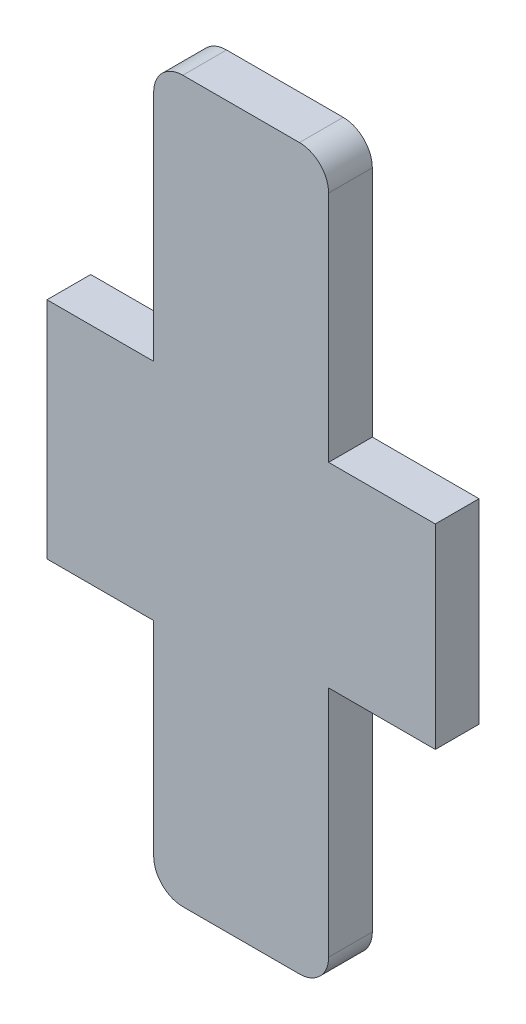
ISO-10303-21;
HEADER;
FILE_DESCRIPTION(('STEP AP214'),'2;1');
FILE_NAME('part.step','',(''),(''),'','','');
FILE_SCHEMA(('AUTOMOTIVE_DESIGN { 1 0 10303 214 1 1 1 1 }'));
ENDSEC;
DATA;
#1=APPLICATION_CONTEXT('core data for automotive mechanical design processes');
#2=APPLICATION_PROTOCOL_DEFINITION('international standard','automotive_design',2000,#1);
#3=PRODUCT_CONTEXT('',#1,'mechanical');
#4=PRODUCT('Part','Part','',(#3));
#5=PRODUCT_RELATED_PRODUCT_CATEGORY('part','',(#4));
#6=PRODUCT_DEFINITION_FORMATION('','',#4);
#7=PRODUCT_DEFINITION_CONTEXT('part definition',#1,'design');
#8=PRODUCT_DEFINITION('design','',#6,#7);
#9=PRODUCT_DEFINITION_SHAPE('','',#8);
#10=(LENGTH_UNIT() NAMED_UNIT(*) SI_UNIT(.MILLI.,.METRE.));
#11=(NAMED_UNIT(*) PLANE_ANGLE_UNIT() SI_UNIT($,.RADIAN.));
#12=(NAMED_UNIT(*) SI_UNIT($,.STERADIAN.) SOLID_ANGLE_UNIT());
#13=UNCERTAINTY_MEASURE_WITH_UNIT(LENGTH_MEASURE(1.E-05),#10,'distance_accuracy_value','');
#14=(GEOMETRIC_REPRESENTATION_CONTEXT(3) GLOBAL_UNCERTAINTY_ASSIGNED_CONTEXT((#13)) GLOBAL_UNIT_ASSIGNED_CONTEXT((#10,
#11,#12)) REPRESENTATION_CONTEXT('',''));
#15=CARTESIAN_POINT('',(0.,0.,0.));
#16=DIRECTION('',(0.,0.,1.));
#17=DIRECTION('',(1.,0.,0.));
#18=AXIS2_PLACEMENT_3D('',#15,#16,#17);
#19=CARTESIAN_POINT('',(-1595.6489981434,-37.3659039223449,3.0000000000004));
#20=DIRECTION('',(0.,1.,0.));
#21=DIRECTION('',(-1.,0.,0.));
#22=AXIS2_PLACEMENT_3D('',#19,#20,#21);
#23=PLANE('',#22);
#24=DIRECTION('',(1.,0.,0.));
#25=VECTOR('',#24,1.);
#26=CARTESIAN_POINT('',(-1595.6489981434,-37.3659039223449,3.67761376907083E-13));
#27=LINE('',#26,#25);
#28=CARTESIAN_POINT('',(-1595.6489981434,-37.3659039223449,3.67761376907083E-13));
#29=VERTEX_POINT('',#28);
#30=CARTESIAN_POINT('',(-1588.32933214503,-37.3659039223449,4.78783679369599E-13));
#31=VERTEX_POINT('',#30);
#32=EDGE_CURVE('E148',#29,#31,#27,.T.);
#33=ORIENTED_EDGE('',*,*,#32,.T.);
#34=DIRECTION('',(0.,0.,-1.));
#35=VECTOR('',#34,1.);
#36=CARTESIAN_POINT('',(-1588.32933214503,-37.3659039223449,3.0000000000005));
#37=LINE('',#36,#35);
#38=CARTESIAN_POINT('',(-1588.32933214503,-37.3659039223449,3.0000000000005));
#39=VERTEX_POINT('',#38);
#40=EDGE_CURVE('E11',#39,#31,#37,.T.);
#41=ORIENTED_EDGE('',*,*,#40,.F.);
#42=DIRECTION('',(1.,0.,0.));
#43=VECTOR('',#42,1.);
#44=CARTESIAN_POINT('',(-1595.6489981434,-37.3659039223449,3.0000000000004));
#45=LINE('',#44,#43);
#46=CARTESIAN_POINT('',(-1595.6489981434,-37.3659039223449,3.0000000000004));
#47=VERTEX_POINT('',#46);
#48=EDGE_CURVE('E191',#47,#39,#45,.T.);
#49=ORIENTED_EDGE('',*,*,#48,.F.);
#50=DIRECTION('',(0.,0.,-1.));
#51=VECTOR('',#50,1.);
#52=CARTESIAN_POINT('',(-1595.6489981434,-37.3659039223449,3.0000000000004));
#53=LINE('',#52,#51);
#54=EDGE_CURVE('E161',#47,#29,#53,.T.);
#55=ORIENTED_EDGE('',*,*,#54,.T.);
#56=EDGE_LOOP('',(#33,#41,#49,#55));
#57=FACE_BOUND('',#56,.T.);
#58=ADVANCED_FACE('F32',(#57),#23,.F.);
#59=CARTESIAN_POINT('',(-1588.32933214503,-37.3659039223449,3.0000000000005));
#60=DIRECTION('',(1.,0.,0.));
#61=DIRECTION('',(0.,1.,0.));
#62=AXIS2_PLACEMENT_3D('',#59,#60,#61);
#63=PLANE('',#62);
#64=DIRECTION('',(0.,-1.,0.));
#65=VECTOR('',#64,1.);
#66=CARTESIAN_POINT('',(-1588.32933214503,-37.3659039223449,4.78783679369599E-13));
#67=LINE('',#66,#65);
#68=CARTESIAN_POINT('',(-1588.32933214503,-51.3659039223446,7.63278329429795E-13));
#69=VERTEX_POINT('',#68);
#70=EDGE_CURVE('E144',#31,#69,#67,.T.);
#71=ORIENTED_EDGE('',*,*,#70,.T.);
#72=DIRECTION('',(0.,0.,-1.));
#73=VECTOR('',#72,1.);
#74=CARTESIAN_POINT('',(-1588.32933214503,-51.3659039223447,3.0000000000005));
#75=LINE('',#74,#73);
#76=CARTESIAN_POINT('',(-1588.32933214503,-51.3659039223447,3.0000000000005));
#77=VERTEX_POINT('',#76);
#78=EDGE_CURVE('E39',#77,#69,#75,.T.);
#79=ORIENTED_EDGE('',*,*,#78,.F.);
#80=DIRECTION('',(0.,-1.,0.));
#81=VECTOR('',#80,1.);
#82=CARTESIAN_POINT('',(-1588.32933214503,-37.3659039223449,3.0000000000005));
#83=LINE('',#82,#81);
#84=EDGE_CURVE('E157',#39,#77,#83,.T.);
#85=ORIENTED_EDGE('',*,*,#84,.F.);
#86=ORIENTED_EDGE('',*,*,#40,.T.);
#87=EDGE_LOOP('',(#71,#79,#85,#86));
#88=FACE_BOUND('',#87,.T.);
#89=ADVANCED_FACE('F156',(#88),#63,.F.);
#90=CARTESIAN_POINT('',(-1586.32933214503,-51.3659039223448,3.0000000000004));
#91=DIRECTION('',(0.,0.,-1.));
#92=DIRECTION('',(-1.,0.,0.));
#93=AXIS2_PLACEMENT_3D('',#90,#91,#92);
#94=CYLINDRICAL_SURFACE('',#93,1.99999999999978);
#95=CARTESIAN_POINT('',(-1586.32933214503,-51.3659039223447,4.85722573273506E-13));
#96=DIRECTION('',(0.,0.,1.));
#97=DIRECTION('',(-1.,0.,0.));
#98=AXIS2_PLACEMENT_3D('',#95,#96,#97);
#99=CIRCLE('',#98,1.99999999999978);
#100=CARTESIAN_POINT('',(-1586.32933214503,-53.3659039223446,2.42861286636753E-13));
#101=VERTEX_POINT('',#100);
#102=EDGE_CURVE('E150',#69,#101,#99,.T.);
#103=ORIENTED_EDGE('',*,*,#102,.T.);
#104=DIRECTION('',(0.,0.,-1.));
#105=VECTOR('',#104,1.);
#106=CARTESIAN_POINT('',(-1586.32933214503,-53.3659039223447,3.00000000000015));
#107=LINE('',#106,#105);
#108=CARTESIAN_POINT('',(-1586.32933214503,-53.3659039223447,3.00000000000015));
#109=VERTEX_POINT('',#108);
#110=EDGE_CURVE('E257',#109,#101,#107,.T.);
#111=ORIENTED_EDGE('',*,*,#110,.F.);
#112=CARTESIAN_POINT('',(-1586.32933214503,-51.3659039223448,3.0000000000004));
#113=DIRECTION('',(0.,0.,1.));
#114=DIRECTION('',(-1.,0.,0.));
#115=AXIS2_PLACEMENT_3D('',#112,#113,#114);
#116=CIRCLE('',#115,1.99999999999978);
#117=EDGE_CURVE('E194',#77,#109,#116,.T.);
#118=ORIENTED_EDGE('',*,*,#117,.F.);
#119=ORIENTED_EDGE('',*,*,#78,.T.);
#120=EDGE_LOOP('',(#103,#111,#118,#119));
#121=FACE_BOUND('',#120,.T.);
#122=ADVANCED_FACE('F261',(#121),#94,.T.);
#123=CARTESIAN_POINT('',(-1586.32933214503,-53.3659039223449,3.00000000000025));
#124=DIRECTION('',(0.,1.,0.));
#125=DIRECTION('',(-1.,0.,0.));
#126=AXIS2_PLACEMENT_3D('',#123,#124,#125);
#127=PLANE('',#126);
#128=DIRECTION('',(1.,0.,0.));
#129=VECTOR('',#128,1.);
#130=CARTESIAN_POINT('',(-1586.32933214503,-53.3659039223448,3.40005801291454E-13));
#131=LINE('',#130,#129);
#132=CARTESIAN_POINT('',(-1578.32933214503,-53.3659039223447,5.82867087928207E-13));
#133=VERTEX_POINT('',#132);
#134=EDGE_CURVE('E165',#101,#133,#131,.T.);
#135=ORIENTED_EDGE('',*,*,#134,.T.);
#136=DIRECTION('',(0.,0.,-1.));
#137=VECTOR('',#136,1.);
#138=CARTESIAN_POINT('',(-1578.32933214503,-53.3659039223447,3.00000000000058));
#139=LINE('',#138,#137);
#140=CARTESIAN_POINT('',(-1578.32933214503,-53.3659039223447,3.00000000000058));
#141=VERTEX_POINT('',#140);
#142=EDGE_CURVE('E254',#141,#133,#139,.T.);
#143=ORIENTED_EDGE('',*,*,#142,.F.);
#144=DIRECTION('',(1.,0.,0.));
#145=VECTOR('',#144,1.);
#146=CARTESIAN_POINT('',(-1586.32933214503,-53.3659039223449,3.00000000000025));
#147=LINE('',#146,#145);
#148=EDGE_CURVE('E196',#109,#141,#147,.T.);
#149=ORIENTED_EDGE('',*,*,#148,.F.);
#150=ORIENTED_EDGE('',*,*,#110,.T.);
#151=EDGE_LOOP('',(#135,#143,#149,#150));
#152=FACE_BOUND('',#151,.T.);
#153=ADVANCED_FACE('F269',(#152),#127,.F.);
#154=CARTESIAN_POINT('',(-1578.32933214503,-51.3659039223447,3.00000000000034));
#155=DIRECTION('',(0.,0.,-1.));
#156=DIRECTION('',(-1.,0.,0.));
#157=AXIS2_PLACEMENT_3D('',#154,#155,#156);
#158=CYLINDRICAL_SURFACE('',#157,1.99999999999969);
#159=CARTESIAN_POINT('',(-1578.32933214503,-51.3659039223447,4.64905891561784E-13));
#160=DIRECTION('',(0.,0.,1.));
#161=DIRECTION('',(1.,0.,0.));
#162=AXIS2_PLACEMENT_3D('',#159,#160,#161);
#163=CIRCLE('',#162,1.99999999999969);
#164=CARTESIAN_POINT('',(-1576.32933214503,-51.3659039223447,5.06539254985228E-13));
#165=VERTEX_POINT('',#164);
#166=EDGE_CURVE('E167',#133,#165,#163,.T.);
#167=ORIENTED_EDGE('',*,*,#166,.T.);
#168=DIRECTION('',(0.,0.,-1.));
#169=VECTOR('',#168,1.);
#170=CARTESIAN_POINT('',(-1576.32933214503,-51.3659039223448,3.00000000000038));
#171=LINE('',#170,#169);
#172=CARTESIAN_POINT('',(-1576.32933214503,-51.3659039223448,3.00000000000038));
#173=VERTEX_POINT('',#172);
#174=EDGE_CURVE('E251',#173,#165,#171,.T.);
#175=ORIENTED_EDGE('',*,*,#174,.F.);
#176=CARTESIAN_POINT('',(-1578.32933214503,-51.3659039223447,3.00000000000034));
#177=DIRECTION('',(0.,0.,1.));
#178=DIRECTION('',(1.,0.,0.));
#179=AXIS2_PLACEMENT_3D('',#176,#177,#178);
#180=CIRCLE('',#179,1.99999999999969);
#181=EDGE_CURVE('E198',#141,#173,#180,.T.);
#182=ORIENTED_EDGE('',*,*,#181,.F.);
#183=ORIENTED_EDGE('',*,*,#142,.T.);
#184=EDGE_LOOP('',(#167,#175,#182,#183));
#185=FACE_BOUND('',#184,.T.);
#186=ADVANCED_FACE('F272',(#185),#158,.T.);
#187=CARTESIAN_POINT('',(-1576.32933214503,-51.3659039223448,3.00000000000036));
#188=DIRECTION('',(-1.,0.,0.));
#189=DIRECTION('',(0.,0.,1.));
#190=AXIS2_PLACEMENT_3D('',#187,#188,#189);
#191=PLANE('',#190);
#192=DIRECTION('',(0.,1.,0.));
#193=VECTOR('',#192,1.);
#194=CARTESIAN_POINT('',(-1576.32933214503,-51.3659039223449,2.28983498828939E-13));
#195=LINE('',#194,#193);
#196=CARTESIAN_POINT('',(-1576.32933214503,-35.3659039223449,1.80411241501588E-13));
#197=VERTEX_POINT('',#196);
#198=EDGE_CURVE('E169',#165,#197,#195,.T.);
#199=ORIENTED_EDGE('',*,*,#198,.T.);
#200=DIRECTION('',(0.,0.,-1.));
#201=VECTOR('',#200,1.);
#202=CARTESIAN_POINT('',(-1576.32933214503,-35.3659039223448,3.00000000000031));
#203=LINE('',#202,#201);
#204=CARTESIAN_POINT('',(-1576.32933214503,-35.3659039223448,3.00000000000031));
#205=VERTEX_POINT('',#204);
#206=EDGE_CURVE('E248',#205,#197,#203,.T.);
#207=ORIENTED_EDGE('',*,*,#206,.F.);
#208=DIRECTION('',(0.,1.,0.));
#209=VECTOR('',#208,1.);
#210=CARTESIAN_POINT('',(-1576.32933214503,-51.3659039223448,3.00000000000036));
#211=LINE('',#210,#209);
#212=EDGE_CURVE('E200',#173,#205,#211,.T.);
#213=ORIENTED_EDGE('',*,*,#212,.F.);
#214=ORIENTED_EDGE('',*,*,#174,.T.);
#215=EDGE_LOOP('',(#199,#207,#213,#214));
#216=FACE_BOUND('',#215,.T.);
#217=ADVANCED_FACE('F277',(#216),#191,.F.);
#218=CARTESIAN_POINT('',(-1576.32933214503,-35.3659039223448,3.00000000000031));
#219=DIRECTION('',(0.,1.,0.));
#220=DIRECTION('',(-1.,0.,0.));
#221=AXIS2_PLACEMENT_3D('',#218,#219,#220);
#222=PLANE('',#221);
#223=DIRECTION('',(1.,0.,0.));
#224=VECTOR('',#223,1.);
#225=CARTESIAN_POINT('',(-1576.32933214503,-35.3659039223449,1.80411241501588E-13));
#226=LINE('',#225,#224);
#227=CARTESIAN_POINT('',(-1569.00966614667,-35.3659039223449,0.));
#228=VERTEX_POINT('',#227);
#229=EDGE_CURVE('E171',#197,#228,#226,.T.);
#230=ORIENTED_EDGE('',*,*,#229,.T.);
#231=DIRECTION('',(0.,0.,-1.));
#232=VECTOR('',#231,1.);
#233=CARTESIAN_POINT('',(-1569.00966614667,-35.3659039223449,3.00000000000027));
#234=LINE('',#233,#232);
#235=CARTESIAN_POINT('',(-1569.00966614667,-35.3659039223449,3.00000000000027));
#236=VERTEX_POINT('',#235);
#237=EDGE_CURVE('E245',#236,#228,#234,.T.);
#238=ORIENTED_EDGE('',*,*,#237,.F.);
#239=DIRECTION('',(1.,0.,0.));
#240=VECTOR('',#239,1.);
#241=CARTESIAN_POINT('',(-1576.32933214503,-35.3659039223448,3.00000000000031));
#242=LINE('',#241,#240);
#243=EDGE_CURVE('E202',#205,#236,#242,.T.);
#244=ORIENTED_EDGE('',*,*,#243,.F.);
#245=ORIENTED_EDGE('',*,*,#206,.T.);
#246=EDGE_LOOP('',(#230,#238,#244,#245));
#247=FACE_BOUND('',#246,.T.);
#248=ADVANCED_FACE('F283',(#247),#222,.F.);
#249=CARTESIAN_POINT('',(-1569.00966614667,-21.965903922344,3.00000000000038));
#250=DIRECTION('',(-1.,0.,0.));
#251=DIRECTION('',(0.,-1.,0.));
#252=AXIS2_PLACEMENT_3D('',#249,#250,#251);
#253=PLANE('',#252);
#254=DIRECTION('',(0.,1.,0.));
#255=VECTOR('',#254,1.);
#256=CARTESIAN_POINT('',(-1569.00966614667,-21.965903922344,3.40005801291454E-13));
#257=LINE('',#256,#255);
#258=CARTESIAN_POINT('',(-1569.00966614667,-21.965903922344,3.40005801291454E-13));
#259=VERTEX_POINT('',#258);
#260=EDGE_CURVE('E173',#228,#259,#257,.T.);
#261=ORIENTED_EDGE('',*,*,#260,.T.);
#262=DIRECTION('',(0.,0.,-1.));
#263=VECTOR('',#262,1.);
#264=CARTESIAN_POINT('',(-1569.00966614667,-21.965903922344,3.00000000000038));
#265=LINE('',#264,#263);
#266=CARTESIAN_POINT('',(-1569.00966614667,-21.965903922344,3.00000000000038));
#267=VERTEX_POINT('',#266);
#268=EDGE_CURVE('E242',#267,#259,#265,.T.);
#269=ORIENTED_EDGE('',*,*,#268,.F.);
#270=DIRECTION('',(0.,1.,0.));
#271=VECTOR('',#270,1.);
#272=CARTESIAN_POINT('',(-1569.00966614667,-21.965903922344,3.00000000000038));
#273=LINE('',#272,#271);
#274=EDGE_CURVE('E204',#236,#267,#273,.T.);
#275=ORIENTED_EDGE('',*,*,#274,.F.);
#276=ORIENTED_EDGE('',*,*,#237,.T.);
#277=EDGE_LOOP('',(#261,#269,#275,#276));
#278=FACE_BOUND('',#277,.T.);
#279=ADVANCED_FACE('F287',(#278),#253,.F.);
#280=CARTESIAN_POINT('',(-1576.32933214503,-21.9659039223443,3.00000000000016));
#281=DIRECTION('',(0.,-1.,0.));
#282=DIRECTION('',(1.,0.,0.));
#283=AXIS2_PLACEMENT_3D('',#280,#281,#282);
#284=PLANE('',#283);
#285=DIRECTION('',(-1.,0.,0.));
#286=VECTOR('',#285,1.);
#287=CARTESIAN_POINT('',(-1576.32933214503,-21.9659039223442,3.81639164714898E-13));
#288=LINE('',#287,#286);
#289=CARTESIAN_POINT('',(-1576.32933214503,-21.9659039223442,3.81639164714898E-13));
#290=VERTEX_POINT('',#289);
#291=EDGE_CURVE('E175',#259,#290,#288,.T.);
#292=ORIENTED_EDGE('',*,*,#291,.T.);
#293=DIRECTION('',(0.,0.,-1.));
#294=VECTOR('',#293,1.);
#295=CARTESIAN_POINT('',(-1576.32933214503,-21.9659039223443,3.00000000000016));
#296=LINE('',#295,#294);
#297=CARTESIAN_POINT('',(-1576.32933214503,-21.9659039223443,3.00000000000016));
#298=VERTEX_POINT('',#297);
#299=EDGE_CURVE('E239',#298,#290,#296,.T.);
#300=ORIENTED_EDGE('',*,*,#299,.F.);
#301=DIRECTION('',(-1.,0.,0.));
#302=VECTOR('',#301,1.);
#303=CARTESIAN_POINT('',(-1576.32933214503,-21.9659039223443,3.00000000000016));
#304=LINE('',#303,#302);
#305=EDGE_CURVE('E206',#267,#298,#304,.T.);
#306=ORIENTED_EDGE('',*,*,#305,.F.);
#307=ORIENTED_EDGE('',*,*,#268,.T.);
#308=EDGE_LOOP('',(#292,#300,#306,#307));
#309=FACE_BOUND('',#308,.T.);
#310=ADVANCED_FACE('F292',(#309),#284,.F.);
#311=CARTESIAN_POINT('',(-1576.32933214503,-5.96590392234418,3.00000000000047));
#312=DIRECTION('',(-1.,0.,0.));
#313=DIRECTION('',(0.,-1.,0.));
#314=AXIS2_PLACEMENT_3D('',#311,#312,#313);
#315=PLANE('',#314);
#316=DIRECTION('',(0.,1.,0.));
#317=VECTOR('',#316,1.);
#318=CARTESIAN_POINT('',(-1576.32933214503,-5.9659039223442,4.30211422042248E-13));
#319=LINE('',#318,#317);
#320=CARTESIAN_POINT('',(-1576.32933214503,-5.9659039223442,4.30211422042248E-13));
#321=VERTEX_POINT('',#320);
#322=EDGE_CURVE('E177',#290,#321,#319,.T.);
#323=ORIENTED_EDGE('',*,*,#322,.T.);
#324=DIRECTION('',(0.,0.,-1.));
#325=VECTOR('',#324,1.);
#326=CARTESIAN_POINT('',(-1576.32933214503,-5.96590392234418,3.00000000000047));
#327=LINE('',#326,#325);
#328=CARTESIAN_POINT('',(-1576.32933214503,-5.96590392234418,3.00000000000047));
#329=VERTEX_POINT('',#328);
#330=EDGE_CURVE('E236',#329,#321,#327,.T.);
#331=ORIENTED_EDGE('',*,*,#330,.F.);
#332=DIRECTION('',(0.,1.,0.));
#333=VECTOR('',#332,1.);
#334=CARTESIAN_POINT('',(-1576.32933214503,-5.96590392234418,3.00000000000047));
#335=LINE('',#334,#333);
#336=EDGE_CURVE('E208',#298,#329,#335,.T.);
#337=ORIENTED_EDGE('',*,*,#336,.F.);
#338=ORIENTED_EDGE('',*,*,#299,.T.);
#339=EDGE_LOOP('',(#323,#331,#337,#338));
#340=FACE_BOUND('',#339,.T.);
#341=ADVANCED_FACE('F298',(#340),#315,.F.);
#342=CARTESIAN_POINT('',(-1578.32933214503,-5.96590392234424,3.00000000000053));
#343=DIRECTION('',(0.,0.,-1.));
#344=DIRECTION('',(-1.,0.,0.));
#345=AXIS2_PLACEMENT_3D('',#342,#343,#344);
#346=CYLINDRICAL_SURFACE('',#345,1.99999999999978);
#347=CARTESIAN_POINT('',(-1578.32933214503,-5.96590392234418,6.10622663543836E-13));
#348=DIRECTION('',(0.,0.,1.));
#349=DIRECTION('',(1.,0.,0.));
#350=AXIS2_PLACEMENT_3D('',#347,#348,#349);
#351=CIRCLE('',#350,1.99999999999978);
#352=CARTESIAN_POINT('',(-1578.32933214503,-3.96590392234457,3.2612801348364E-13));
#353=VERTEX_POINT('',#352);
#354=EDGE_CURVE('E179',#321,#353,#351,.T.);
#355=ORIENTED_EDGE('',*,*,#354,.T.);
#356=DIRECTION('',(0.,0.,-1.));
#357=VECTOR('',#356,1.);
#358=CARTESIAN_POINT('',(-1578.32933214503,-3.96590392234462,3.00000000000022));
#359=LINE('',#358,#357);
#360=CARTESIAN_POINT('',(-1578.32933214503,-3.96590392234462,3.00000000000022));
#361=VERTEX_POINT('',#360);
#362=EDGE_CURVE('E233',#361,#353,#359,.T.);
#363=ORIENTED_EDGE('',*,*,#362,.F.);
#364=CARTESIAN_POINT('',(-1578.32933214503,-5.96590392234424,3.00000000000053));
#365=DIRECTION('',(0.,0.,1.));
#366=DIRECTION('',(1.,0.,0.));
#367=AXIS2_PLACEMENT_3D('',#364,#365,#366);
#368=CIRCLE('',#367,1.99999999999978);
#369=EDGE_CURVE('E210',#329,#361,#368,.T.);
#370=ORIENTED_EDGE('',*,*,#369,.F.);
#371=ORIENTED_EDGE('',*,*,#330,.T.);
#372=EDGE_LOOP('',(#355,#363,#370,#371));
#373=FACE_BOUND('',#372,.T.);
#374=ADVANCED_FACE('F302',(#373),#346,.T.);
#375=CARTESIAN_POINT('',(-1586.32933214503,-3.96590392234467,3.00000000000026));
#376=DIRECTION('',(0.,-1.,0.));
#377=DIRECTION('',(1.,0.,0.));
#378=AXIS2_PLACEMENT_3D('',#375,#376,#377);
#379=PLANE('',#378);
#380=DIRECTION('',(-1.,0.,0.));
#381=VECTOR('',#380,1.);
#382=CARTESIAN_POINT('',(-1586.32933214503,-3.96590392234459,3.95516952522712E-13));
#383=LINE('',#382,#381);
#384=CARTESIAN_POINT('',(-1586.32933214503,-3.96590392234459,3.95516952522712E-13));
#385=VERTEX_POINT('',#384);
#386=EDGE_CURVE('E181',#353,#385,#383,.T.);
#387=ORIENTED_EDGE('',*,*,#386,.T.);
#388=DIRECTION('',(0.,0.,-1.));
#389=VECTOR('',#388,1.);
#390=CARTESIAN_POINT('',(-1586.32933214503,-3.96590392234467,3.00000000000026));
#391=LINE('',#390,#389);
#392=CARTESIAN_POINT('',(-1586.32933214503,-3.96590392234467,3.00000000000026));
#393=VERTEX_POINT('',#392);
#394=EDGE_CURVE('E230',#393,#385,#391,.T.);
#395=ORIENTED_EDGE('',*,*,#394,.F.);
#396=DIRECTION('',(-1.,0.,0.));
#397=VECTOR('',#396,1.);
#398=CARTESIAN_POINT('',(-1586.32933214503,-3.96590392234467,3.00000000000026));
#399=LINE('',#398,#397);
#400=EDGE_CURVE('E212',#361,#393,#399,.T.);
#401=ORIENTED_EDGE('',*,*,#400,.F.);
#402=ORIENTED_EDGE('',*,*,#362,.T.);
#403=EDGE_LOOP('',(#387,#395,#401,#402));
#404=FACE_BOUND('',#403,.T.);
#405=ADVANCED_FACE('F307',(#404),#379,.F.);
#406=CARTESIAN_POINT('',(-1586.32933214503,-5.96590392234468,3.00000000000025));
#407=DIRECTION('',(0.,0.,-1.));
#408=DIRECTION('',(-1.,0.,0.));
#409=AXIS2_PLACEMENT_3D('',#406,#407,#408);
#410=CYLINDRICAL_SURFACE('',#409,1.99999999999978);
#411=CARTESIAN_POINT('',(-1586.32933214503,-5.9659039223447,2.08166817117217E-13));
#412=DIRECTION('',(0.,0.,1.));
#413=DIRECTION('',(-1.,0.,0.));
#414=AXIS2_PLACEMENT_3D('',#411,#412,#413);
#415=CIRCLE('',#414,1.99999999999978);
#416=CARTESIAN_POINT('',(-1588.32933214503,-5.9659039223447,3.40005801291454E-13));
#417=VERTEX_POINT('',#416);
#418=EDGE_CURVE('E183',#385,#417,#415,.T.);
#419=ORIENTED_EDGE('',*,*,#418,.T.);
#420=DIRECTION('',(0.,0.,-1.));
#421=VECTOR('',#420,1.);
#422=CARTESIAN_POINT('',(-1588.32933214503,-5.96590392234468,3.00000000000038));
#423=LINE('',#422,#421);
#424=CARTESIAN_POINT('',(-1588.32933214503,-5.96590392234468,3.00000000000038));
#425=VERTEX_POINT('',#424);
#426=EDGE_CURVE('E227',#425,#417,#423,.T.);
#427=ORIENTED_EDGE('',*,*,#426,.F.);
#428=CARTESIAN_POINT('',(-1586.32933214503,-5.96590392234468,3.00000000000025));
#429=DIRECTION('',(0.,0.,1.));
#430=DIRECTION('',(-1.,0.,0.));
#431=AXIS2_PLACEMENT_3D('',#428,#429,#430);
#432=CIRCLE('',#431,1.99999999999978);
#433=EDGE_CURVE('E214',#393,#425,#432,.T.);
#434=ORIENTED_EDGE('',*,*,#433,.F.);
#435=ORIENTED_EDGE('',*,*,#394,.T.);
#436=EDGE_LOOP('',(#419,#427,#434,#435));
#437=FACE_BOUND('',#436,.T.);
#438=ADVANCED_FACE('F313',(#437),#410,.T.);
#439=CARTESIAN_POINT('',(-1588.32933214503,-21.9659039223447,3.00000000000034));
#440=DIRECTION('',(1.,0.,0.));
#441=DIRECTION('',(0.,1.,0.));
#442=AXIS2_PLACEMENT_3D('',#439,#440,#441);
#443=PLANE('',#442);
#444=DIRECTION('',(0.,-1.,0.));
#445=VECTOR('',#444,1.);
#446=CARTESIAN_POINT('',(-1588.32933214503,-21.9659039223446,4.30211422042248E-13));
#447=LINE('',#446,#445);
#448=CARTESIAN_POINT('',(-1588.32933214503,-21.9659039223446,4.30211422042248E-13));
#449=VERTEX_POINT('',#448);
#450=EDGE_CURVE('E185',#417,#449,#447,.T.);
#451=ORIENTED_EDGE('',*,*,#450,.T.);
#452=DIRECTION('',(0.,0.,-1.));
#453=VECTOR('',#452,1.);
#454=CARTESIAN_POINT('',(-1588.32933214503,-21.9659039223447,3.00000000000034));
#455=LINE('',#454,#453);
#456=CARTESIAN_POINT('',(-1588.32933214503,-21.9659039223447,3.00000000000034));
#457=VERTEX_POINT('',#456);
#458=EDGE_CURVE('E224',#457,#449,#455,.T.);
#459=ORIENTED_EDGE('',*,*,#458,.F.);
#460=DIRECTION('',(0.,-1.,0.));
#461=VECTOR('',#460,1.);
#462=CARTESIAN_POINT('',(-1588.32933214503,-21.9659039223447,3.00000000000034));
#463=LINE('',#462,#461);
#464=EDGE_CURVE('E216',#425,#457,#463,.T.);
#465=ORIENTED_EDGE('',*,*,#464,.F.);
#466=ORIENTED_EDGE('',*,*,#426,.T.);
#467=EDGE_LOOP('',(#451,#459,#465,#466));
#468=FACE_BOUND('',#467,.T.);
#469=ADVANCED_FACE('F317',(#468),#443,.F.);
#470=CARTESIAN_POINT('',(-1595.6489981434,-21.965903922345,3.00000000000029));
#471=DIRECTION('',(0.,-1.,0.));
#472=DIRECTION('',(1.,0.,0.));
#473=AXIS2_PLACEMENT_3D('',#470,#471,#472);
#474=PLANE('',#473);
#475=DIRECTION('',(-1.,0.,0.));
#476=VECTOR('',#475,1.);
#477=CARTESIAN_POINT('',(-1595.6489981434,-21.9659039223449,5.27355936696949E-13));
#478=LINE('',#477,#476);
#479=CARTESIAN_POINT('',(-1595.6489981434,-21.9659039223449,5.27355936696949E-13));
#480=VERTEX_POINT('',#479);
#481=EDGE_CURVE('E187',#449,#480,#478,.T.);
#482=ORIENTED_EDGE('',*,*,#481,.T.);
#483=DIRECTION('',(0.,0.,-1.));
#484=VECTOR('',#483,1.);
#485=CARTESIAN_POINT('',(-1595.6489981434,-21.965903922345,3.00000000000029));
#486=LINE('',#485,#484);
#487=CARTESIAN_POINT('',(-1595.6489981434,-21.965903922345,3.00000000000029));
#488=VERTEX_POINT('',#487);
#489=EDGE_CURVE('E221',#488,#480,#486,.T.);
#490=ORIENTED_EDGE('',*,*,#489,.F.);
#491=DIRECTION('',(-1.,0.,0.));
#492=VECTOR('',#491,1.);
#493=CARTESIAN_POINT('',(-1595.6489981434,-21.965903922345,3.00000000000029));
#494=LINE('',#493,#492);
#495=EDGE_CURVE('E51',#457,#488,#494,.T.);
#496=ORIENTED_EDGE('',*,*,#495,.F.);
#497=ORIENTED_EDGE('',*,*,#458,.T.);
#498=EDGE_LOOP('',(#482,#490,#496,#497));
#499=FACE_BOUND('',#498,.T.);
#500=ADVANCED_FACE('F320',(#499),#474,.F.);
#501=CARTESIAN_POINT('',(-1595.6489981434,-21.965903922345,3.00000000000029));
#502=DIRECTION('',(1.,0.,0.));
#503=DIRECTION('',(0.,1.,0.));
#504=AXIS2_PLACEMENT_3D('',#501,#502,#503);
#505=PLANE('',#504);
#506=DIRECTION('',(0.,-1.,0.));
#507=VECTOR('',#506,1.);
#508=CARTESIAN_POINT('',(-1595.6489981434,-21.9659039223449,5.27355936696949E-13));
#509=LINE('',#508,#507);
#510=EDGE_CURVE('E189',#480,#29,#509,.T.);
#511=ORIENTED_EDGE('',*,*,#510,.T.);
#512=ORIENTED_EDGE('',*,*,#54,.F.);
#513=DIRECTION('',(0.,-1.,0.));
#514=VECTOR('',#513,1.);
#515=CARTESIAN_POINT('',(-1595.6489981434,-21.965903922345,3.00000000000029));
#516=LINE('',#515,#514);
#517=EDGE_CURVE('E46',#488,#47,#516,.T.);
#518=ORIENTED_EDGE('',*,*,#517,.F.);
#519=ORIENTED_EDGE('',*,*,#489,.T.);
#520=EDGE_LOOP('',(#511,#512,#518,#519));
#521=FACE_BOUND('',#520,.T.);
#522=ADVANCED_FACE('F322',(#521),#505,.F.);
#523=CARTESIAN_POINT('',(-1586.32933214503,-51.3659039223448,3.0000000000004));
#524=DIRECTION('',(0.,0.,-1.));
#525=DIRECTION('',(-1.,0.,0.));
#526=AXIS2_PLACEMENT_3D('',#523,#524,#525);
#527=PLANE('',#526);
#528=ORIENTED_EDGE('',*,*,#48,.T.);
#529=ORIENTED_EDGE('',*,*,#84,.T.);
#530=ORIENTED_EDGE('',*,*,#117,.T.);
#531=ORIENTED_EDGE('',*,*,#148,.T.);
#532=ORIENTED_EDGE('',*,*,#181,.T.);
#533=ORIENTED_EDGE('',*,*,#212,.T.);
#534=ORIENTED_EDGE('',*,*,#243,.T.);
#535=ORIENTED_EDGE('',*,*,#274,.T.);
#536=ORIENTED_EDGE('',*,*,#305,.T.);
#537=ORIENTED_EDGE('',*,*,#336,.T.);
#538=ORIENTED_EDGE('',*,*,#369,.T.);
#539=ORIENTED_EDGE('',*,*,#400,.T.);
#540=ORIENTED_EDGE('',*,*,#433,.T.);
#541=ORIENTED_EDGE('',*,*,#464,.T.);
#542=ORIENTED_EDGE('',*,*,#495,.T.);
#543=ORIENTED_EDGE('',*,*,#517,.T.);
#544=EDGE_LOOP('',(#528,#529,#530,#531,#532,#533,#534,#535,#536,#537,#538,#539,#540,#541,#542,#543));
#545=FACE_BOUND('',#544,.T.);
#546=ADVANCED_FACE('F264',(#545),#527,.F.);
#547=CARTESIAN_POINT('',(-1586.32933214503,-51.3659039223447,4.85722573273506E-13));
#548=DIRECTION('',(0.,0.,-1.));
#549=DIRECTION('',(-1.,0.,0.));
#550=AXIS2_PLACEMENT_3D('',#547,#548,#549);
#551=PLANE('',#550);
#552=ORIENTED_EDGE('',*,*,#32,.F.);
#553=ORIENTED_EDGE('',*,*,#510,.F.);
#554=ORIENTED_EDGE('',*,*,#481,.F.);
#555=ORIENTED_EDGE('',*,*,#450,.F.);
#556=ORIENTED_EDGE('',*,*,#418,.F.);
#557=ORIENTED_EDGE('',*,*,#386,.F.);
#558=ORIENTED_EDGE('',*,*,#354,.F.);
#559=ORIENTED_EDGE('',*,*,#322,.F.);
#560=ORIENTED_EDGE('',*,*,#291,.F.);
#561=ORIENTED_EDGE('',*,*,#260,.F.);
#562=ORIENTED_EDGE('',*,*,#229,.F.);
#563=ORIENTED_EDGE('',*,*,#198,.F.);
#564=ORIENTED_EDGE('',*,*,#166,.F.);
#565=ORIENTED_EDGE('',*,*,#134,.F.);
#566=ORIENTED_EDGE('',*,*,#102,.F.);
#567=ORIENTED_EDGE('',*,*,#70,.F.);
#568=EDGE_LOOP('',(#552,#553,#554,#555,#556,#557,#558,#559,#560,#561,#562,#563,#564,#565,#566,#567));
#569=FACE_BOUND('',#568,.T.);
#570=ADVANCED_FACE('F145',(#569),#551,.T.);
#571=CLOSED_SHELL('',(#58,#89,#122,#153,#186,#217,#248,#279,#310,#341,#374,#405,#438,#469,#500,
#522,#546,#570));
#572=MANIFOLD_SOLID_BREP('B2',#571);
#573=ADVANCED_BREP_SHAPE_REPRESENTATION('',(#18,#572),#14);
#574=SHAPE_DEFINITION_REPRESENTATION(#9,#573);
ENDSEC;
END-ISO-10303-21;
